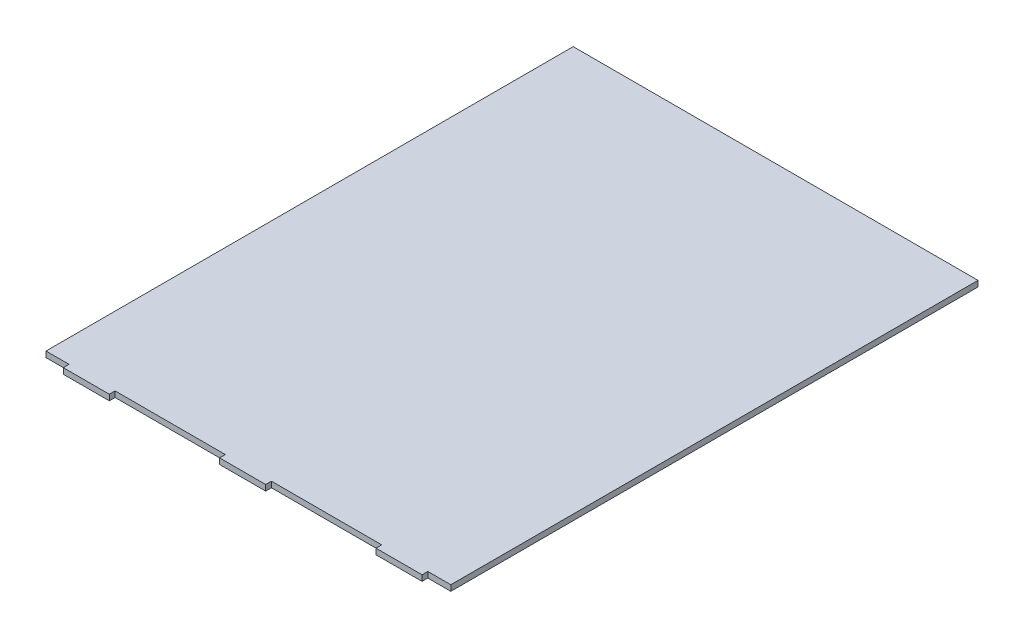
ISO-10303-21;
HEADER;
FILE_DESCRIPTION(('STEP AP214'),'2;1');
FILE_NAME('part.step','',(''),(''),'','','');
FILE_SCHEMA(('AUTOMOTIVE_DESIGN { 1 0 10303 214 1 1 1 1 }'));
ENDSEC;
DATA;
#1=APPLICATION_CONTEXT('core data for automotive mechanical design processes');
#2=APPLICATION_PROTOCOL_DEFINITION('international standard','automotive_design',2000,#1);
#3=PRODUCT_CONTEXT('',#1,'mechanical');
#4=PRODUCT('Part','Part','',(#3));
#5=PRODUCT_RELATED_PRODUCT_CATEGORY('part','',(#4));
#6=PRODUCT_DEFINITION_FORMATION('','',#4);
#7=PRODUCT_DEFINITION_CONTEXT('part definition',#1,'design');
#8=PRODUCT_DEFINITION('design','',#6,#7);
#9=PRODUCT_DEFINITION_SHAPE('','',#8);
#10=(LENGTH_UNIT() NAMED_UNIT(*) SI_UNIT(.MILLI.,.METRE.));
#11=(NAMED_UNIT(*) PLANE_ANGLE_UNIT() SI_UNIT($,.RADIAN.));
#12=(NAMED_UNIT(*) SI_UNIT($,.STERADIAN.) SOLID_ANGLE_UNIT());
#13=UNCERTAINTY_MEASURE_WITH_UNIT(LENGTH_MEASURE(1.E-05),#10,'distance_accuracy_value','');
#14=(GEOMETRIC_REPRESENTATION_CONTEXT(3) GLOBAL_UNCERTAINTY_ASSIGNED_CONTEXT((#13)) GLOBAL_UNIT_ASSIGNED_CONTEXT((#10,
#11,#12)) REPRESENTATION_CONTEXT('',''));
#15=CARTESIAN_POINT('',(0.,0.,0.));
#16=DIRECTION('',(0.,0.,1.));
#17=DIRECTION('',(1.,0.,0.));
#18=AXIS2_PLACEMENT_3D('',#15,#16,#17);
#19=CARTESIAN_POINT('',(0.,3.175,0.));
#20=DIRECTION('',(1.,0.,0.));
#21=DIRECTION('',(0.,0.,-1.));
#22=AXIS2_PLACEMENT_3D('',#19,#20,#21);
#23=PLANE('',#22);
#24=DIRECTION('',(0.,0.,1.));
#25=VECTOR('',#24,1.);
#26=CARTESIAN_POINT('',(0.,0.,0.));
#27=LINE('',#26,#25);
#28=CARTESIAN_POINT('',(0.,0.,-290.83));
#29=VERTEX_POINT('',#28);
#30=CARTESIAN_POINT('',(0.,0.,0.));
#31=VERTEX_POINT('',#30);
#32=EDGE_CURVE('E178',#29,#31,#27,.T.);
#33=ORIENTED_EDGE('',*,*,#32,.T.);
#34=DIRECTION('',(0.,-1.,0.));
#35=VECTOR('',#34,1.);
#36=CARTESIAN_POINT('',(0.,3.175,0.));
#37=LINE('',#36,#35);
#38=CARTESIAN_POINT('',(0.,3.175,0.));
#39=VERTEX_POINT('',#38);
#40=EDGE_CURVE('E11',#39,#31,#37,.T.);
#41=ORIENTED_EDGE('',*,*,#40,.F.);
#42=DIRECTION('',(0.,0.,1.));
#43=VECTOR('',#42,1.);
#44=CARTESIAN_POINT('',(0.,3.175,0.));
#45=LINE('',#44,#43);
#46=CARTESIAN_POINT('',(0.,3.175,-290.83));
#47=VERTEX_POINT('',#46);
#48=EDGE_CURVE('E210',#47,#39,#45,.T.);
#49=ORIENTED_EDGE('',*,*,#48,.F.);
#50=DIRECTION('',(0.,-1.,0.));
#51=VECTOR('',#50,1.);
#52=CARTESIAN_POINT('',(0.,3.175,-290.83));
#53=LINE('',#52,#51);
#54=EDGE_CURVE('E174',#47,#29,#53,.T.);
#55=ORIENTED_EDGE('',*,*,#54,.T.);
#56=EDGE_LOOP('',(#33,#41,#49,#55));
#57=FACE_BOUND('',#56,.T.);
#58=ADVANCED_FACE('F34',(#57),#23,.F.);
#59=CARTESIAN_POINT('',(0.,3.175,0.));
#60=DIRECTION('',(0.,0.,-1.));
#61=DIRECTION('',(-1.,0.,0.));
#62=AXIS2_PLACEMENT_3D('',#59,#60,#61);
#63=PLANE('',#62);
#64=DIRECTION('',(1.,0.,0.));
#65=VECTOR('',#64,1.);
#66=CARTESIAN_POINT('',(0.,0.,0.));
#67=LINE('',#66,#65);
#68=CARTESIAN_POINT('',(12.7,0.,0.));
#69=VERTEX_POINT('',#68);
#70=EDGE_CURVE('E181',#31,#69,#67,.T.);
#71=ORIENTED_EDGE('',*,*,#70,.T.);
#72=DIRECTION('',(0.,-1.,0.));
#73=VECTOR('',#72,1.);
#74=CARTESIAN_POINT('',(12.7,3.175,0.));
#75=LINE('',#74,#73);
#76=CARTESIAN_POINT('',(12.7,3.175,0.));
#77=VERTEX_POINT('',#76);
#78=EDGE_CURVE('E42',#77,#69,#75,.T.);
#79=ORIENTED_EDGE('',*,*,#78,.F.);
#80=DIRECTION('',(1.,0.,0.));
#81=VECTOR('',#80,1.);
#82=CARTESIAN_POINT('',(0.,3.175,0.));
#83=LINE('',#82,#81);
#84=EDGE_CURVE('E117',#39,#77,#83,.T.);
#85=ORIENTED_EDGE('',*,*,#84,.F.);
#86=ORIENTED_EDGE('',*,*,#40,.T.);
#87=EDGE_LOOP('',(#71,#79,#85,#86));
#88=FACE_BOUND('',#87,.T.);
#89=ADVANCED_FACE('F307',(#88),#63,.F.);
#90=CARTESIAN_POINT('',(12.7,3.175,3.175));
#91=DIRECTION('',(1.,0.,0.));
#92=DIRECTION('',(0.,0.,-1.));
#93=AXIS2_PLACEMENT_3D('',#90,#91,#92);
#94=PLANE('',#93);
#95=DIRECTION('',(0.,0.,1.));
#96=VECTOR('',#95,1.);
#97=CARTESIAN_POINT('',(12.7,0.,3.175));
#98=LINE('',#97,#96);
#99=CARTESIAN_POINT('',(12.7,0.,3.175));
#100=VERTEX_POINT('',#99);
#101=EDGE_CURVE('E183',#69,#100,#98,.T.);
#102=ORIENTED_EDGE('',*,*,#101,.T.);
#103=DIRECTION('',(0.,-1.,0.));
#104=VECTOR('',#103,1.);
#105=CARTESIAN_POINT('',(12.7,3.175,3.175));
#106=LINE('',#105,#104);
#107=CARTESIAN_POINT('',(12.7,3.175,3.175));
#108=VERTEX_POINT('',#107);
#109=EDGE_CURVE('E241',#108,#100,#106,.T.);
#110=ORIENTED_EDGE('',*,*,#109,.F.);
#111=DIRECTION('',(0.,0.,1.));
#112=VECTOR('',#111,1.);
#113=CARTESIAN_POINT('',(12.7,3.175,3.175));
#114=LINE('',#113,#112);
#115=EDGE_CURVE('E249',#77,#108,#114,.T.);
#116=ORIENTED_EDGE('',*,*,#115,.F.);
#117=ORIENTED_EDGE('',*,*,#78,.T.);
#118=EDGE_LOOP('',(#102,#110,#116,#117));
#119=FACE_BOUND('',#118,.T.);
#120=ADVANCED_FACE('F247',(#119),#94,.F.);
#121=CARTESIAN_POINT('',(12.7,3.175,3.175));
#122=DIRECTION('',(0.,0.,-1.));
#123=DIRECTION('',(-1.,0.,0.));
#124=AXIS2_PLACEMENT_3D('',#121,#122,#123);
#125=PLANE('',#124);
#126=DIRECTION('',(1.,0.,0.));
#127=VECTOR('',#126,1.);
#128=CARTESIAN_POINT('',(12.7,0.,3.175));
#129=LINE('',#128,#127);
#130=CARTESIAN_POINT('',(38.1,0.,3.175));
#131=VERTEX_POINT('',#130);
#132=EDGE_CURVE('E185',#100,#131,#129,.T.);
#133=ORIENTED_EDGE('',*,*,#132,.T.);
#134=DIRECTION('',(0.,-1.,0.));
#135=VECTOR('',#134,1.);
#136=CARTESIAN_POINT('',(38.1,3.175,3.175));
#137=LINE('',#136,#135);
#138=CARTESIAN_POINT('',(38.1,3.175,3.175));
#139=VERTEX_POINT('',#138);
#140=EDGE_CURVE('E238',#139,#131,#137,.T.);
#141=ORIENTED_EDGE('',*,*,#140,.F.);
#142=DIRECTION('',(1.,0.,0.));
#143=VECTOR('',#142,1.);
#144=CARTESIAN_POINT('',(12.7,3.175,3.175));
#145=LINE('',#144,#143);
#146=EDGE_CURVE('E266',#108,#139,#145,.T.);
#147=ORIENTED_EDGE('',*,*,#146,.F.);
#148=ORIENTED_EDGE('',*,*,#109,.T.);
#149=EDGE_LOOP('',(#133,#141,#147,#148));
#150=FACE_BOUND('',#149,.T.);
#151=ADVANCED_FACE('F257',(#150),#125,.F.);
#152=CARTESIAN_POINT('',(38.1,3.175,3.175));
#153=DIRECTION('',(-1.,0.,0.));
#154=DIRECTION('',(0.,0.,1.));
#155=AXIS2_PLACEMENT_3D('',#152,#153,#154);
#156=PLANE('',#155);
#157=DIRECTION('',(0.,0.,-1.));
#158=VECTOR('',#157,1.);
#159=CARTESIAN_POINT('',(38.1,0.,3.175));
#160=LINE('',#159,#158);
#161=CARTESIAN_POINT('',(38.1,0.,0.));
#162=VERTEX_POINT('',#161);
#163=EDGE_CURVE('E187',#131,#162,#160,.T.);
#164=ORIENTED_EDGE('',*,*,#163,.T.);
#165=DIRECTION('',(0.,-1.,0.));
#166=VECTOR('',#165,1.);
#167=CARTESIAN_POINT('',(38.1,3.175,0.));
#168=LINE('',#167,#166);
#169=CARTESIAN_POINT('',(38.1,3.175,0.));
#170=VERTEX_POINT('',#169);
#171=EDGE_CURVE('E235',#170,#162,#168,.T.);
#172=ORIENTED_EDGE('',*,*,#171,.F.);
#173=DIRECTION('',(0.,0.,-1.));
#174=VECTOR('',#173,1.);
#175=CARTESIAN_POINT('',(38.1,3.175,3.175));
#176=LINE('',#175,#174);
#177=EDGE_CURVE('E263',#139,#170,#176,.T.);
#178=ORIENTED_EDGE('',*,*,#177,.F.);
#179=ORIENTED_EDGE('',*,*,#140,.T.);
#180=EDGE_LOOP('',(#164,#172,#178,#179));
#181=FACE_BOUND('',#180,.T.);
#182=ADVANCED_FACE('F261',(#181),#156,.F.);
#183=CARTESIAN_POINT('',(96.7224283645198,3.175,0.));
#184=DIRECTION('',(0.,0.,-1.));
#185=DIRECTION('',(-1.,0.,0.));
#186=AXIS2_PLACEMENT_3D('',#183,#184,#185);
#187=PLANE('',#186);
#188=DIRECTION('',(1.,0.,0.));
#189=VECTOR('',#188,1.);
#190=CARTESIAN_POINT('',(96.7224283645198,0.,0.));
#191=LINE('',#190,#189);
#192=CARTESIAN_POINT('',(98.95586,0.,0.));
#193=VERTEX_POINT('',#192);
#194=EDGE_CURVE('E190',#162,#193,#191,.T.);
#195=ORIENTED_EDGE('',*,*,#194,.T.);
#196=DIRECTION('',(0.,-1.,0.));
#197=VECTOR('',#196,1.);
#198=CARTESIAN_POINT('',(98.95586,3.175,0.));
#199=LINE('',#198,#197);
#200=CARTESIAN_POINT('',(98.95586,3.175,0.));
#201=VERTEX_POINT('',#200);
#202=EDGE_CURVE('E232',#201,#193,#199,.T.);
#203=ORIENTED_EDGE('',*,*,#202,.F.);
#204=DIRECTION('',(1.,0.,0.));
#205=VECTOR('',#204,1.);
#206=CARTESIAN_POINT('',(38.1,3.175,0.));
#207=LINE('',#206,#205);
#208=EDGE_CURVE('E265',#170,#201,#207,.T.);
#209=ORIENTED_EDGE('',*,*,#208,.F.);
#210=ORIENTED_EDGE('',*,*,#171,.T.);
#211=EDGE_LOOP('',(#195,#203,#209,#210));
#212=FACE_BOUND('',#211,.T.);
#213=ADVANCED_FACE('F320',(#212),#187,.F.);
#214=CARTESIAN_POINT('',(98.95586,3.175,0.));
#215=DIRECTION('',(1.,0.,0.));
#216=DIRECTION('',(0.,0.,-1.));
#217=AXIS2_PLACEMENT_3D('',#214,#215,#216);
#218=PLANE('',#217);
#219=DIRECTION('',(0.,0.,1.));
#220=VECTOR('',#219,1.);
#221=CARTESIAN_POINT('',(98.95586,0.,0.));
#222=LINE('',#221,#220);
#223=CARTESIAN_POINT('',(98.95586,0.,3.175));
#224=VERTEX_POINT('',#223);
#225=EDGE_CURVE('E192',#193,#224,#222,.T.);
#226=ORIENTED_EDGE('',*,*,#225,.T.);
#227=DIRECTION('',(0.,-1.,0.));
#228=VECTOR('',#227,1.);
#229=CARTESIAN_POINT('',(98.95586,3.175,3.175));
#230=LINE('',#229,#228);
#231=CARTESIAN_POINT('',(98.95586,3.175,3.175));
#232=VERTEX_POINT('',#231);
#233=EDGE_CURVE('E229',#232,#224,#230,.T.);
#234=ORIENTED_EDGE('',*,*,#233,.F.);
#235=DIRECTION('',(0.,0.,1.));
#236=VECTOR('',#235,1.);
#237=CARTESIAN_POINT('',(98.95586,3.175,0.));
#238=LINE('',#237,#236);
#239=EDGE_CURVE('E268',#201,#232,#238,.T.);
#240=ORIENTED_EDGE('',*,*,#239,.F.);
#241=ORIENTED_EDGE('',*,*,#202,.T.);
#242=EDGE_LOOP('',(#226,#234,#240,#241));
#243=FACE_BOUND('',#242,.T.);
#244=ADVANCED_FACE('F323',(#243),#218,.F.);
#245=CARTESIAN_POINT('',(98.95586,3.175,3.175));
#246=DIRECTION('',(0.,0.,-1.));
#247=DIRECTION('',(-1.,0.,0.));
#248=AXIS2_PLACEMENT_3D('',#245,#246,#247);
#249=PLANE('',#248);
#250=DIRECTION('',(1.,0.,0.));
#251=VECTOR('',#250,1.);
#252=CARTESIAN_POINT('',(98.95586,0.,3.175));
#253=LINE('',#252,#251);
#254=CARTESIAN_POINT('',(124.35586,0.,3.175));
#255=VERTEX_POINT('',#254);
#256=EDGE_CURVE('E194',#224,#255,#253,.T.);
#257=ORIENTED_EDGE('',*,*,#256,.T.);
#258=DIRECTION('',(0.,-1.,0.));
#259=VECTOR('',#258,1.);
#260=CARTESIAN_POINT('',(124.35586,3.175,3.175));
#261=LINE('',#260,#259);
#262=CARTESIAN_POINT('',(124.35586,3.175,3.175));
#263=VERTEX_POINT('',#262);
#264=EDGE_CURVE('E226',#263,#255,#261,.T.);
#265=ORIENTED_EDGE('',*,*,#264,.F.);
#266=DIRECTION('',(1.,0.,0.));
#267=VECTOR('',#266,1.);
#268=CARTESIAN_POINT('',(98.95586,3.175,3.175));
#269=LINE('',#268,#267);
#270=EDGE_CURVE('E274',#232,#263,#269,.T.);
#271=ORIENTED_EDGE('',*,*,#270,.F.);
#272=ORIENTED_EDGE('',*,*,#233,.T.);
#273=EDGE_LOOP('',(#257,#265,#271,#272));
#274=FACE_BOUND('',#273,.T.);
#275=ADVANCED_FACE('F327',(#274),#249,.F.);
#276=CARTESIAN_POINT('',(124.35586,3.175,0.));
#277=DIRECTION('',(-1.,0.,0.));
#278=DIRECTION('',(0.,0.,1.));
#279=AXIS2_PLACEMENT_3D('',#276,#277,#278);
#280=PLANE('',#279);
#281=DIRECTION('',(0.,0.,-1.));
#282=VECTOR('',#281,1.);
#283=CARTESIAN_POINT('',(124.35586,0.,0.));
#284=LINE('',#283,#282);
#285=CARTESIAN_POINT('',(124.35586,0.,0.));
#286=VERTEX_POINT('',#285);
#287=EDGE_CURVE('E196',#255,#286,#284,.T.);
#288=ORIENTED_EDGE('',*,*,#287,.T.);
#289=DIRECTION('',(0.,-1.,0.));
#290=VECTOR('',#289,1.);
#291=CARTESIAN_POINT('',(124.35586,3.175,0.));
#292=LINE('',#291,#290);
#293=CARTESIAN_POINT('',(124.35586,3.175,0.));
#294=VERTEX_POINT('',#293);
#295=EDGE_CURVE('E223',#294,#286,#292,.T.);
#296=ORIENTED_EDGE('',*,*,#295,.F.);
#297=DIRECTION('',(0.,0.,-1.));
#298=VECTOR('',#297,1.);
#299=CARTESIAN_POINT('',(124.35586,3.175,0.));
#300=LINE('',#299,#298);
#301=EDGE_CURVE('E276',#263,#294,#300,.T.);
#302=ORIENTED_EDGE('',*,*,#301,.F.);
#303=ORIENTED_EDGE('',*,*,#264,.T.);
#304=EDGE_LOOP('',(#288,#296,#302,#303));
#305=FACE_BOUND('',#304,.T.);
#306=ADVANCED_FACE('F331',(#305),#280,.F.);
#307=CARTESIAN_POINT('',(180.74485672904,3.175,0.));
#308=DIRECTION('',(0.,0.,-1.));
#309=DIRECTION('',(-1.,0.,0.));
#310=AXIS2_PLACEMENT_3D('',#307,#308,#309);
#311=PLANE('',#310);
#312=DIRECTION('',(1.,0.,0.));
#313=VECTOR('',#312,1.);
#314=CARTESIAN_POINT('',(180.74485672904,0.,0.));
#315=LINE('',#314,#313);
#316=CARTESIAN_POINT('',(185.21172,0.,0.));
#317=VERTEX_POINT('',#316);
#318=EDGE_CURVE('E199',#286,#317,#315,.T.);
#319=ORIENTED_EDGE('',*,*,#318,.T.);
#320=DIRECTION('',(0.,-1.,0.));
#321=VECTOR('',#320,1.);
#322=CARTESIAN_POINT('',(185.21172,3.175,0.));
#323=LINE('',#322,#321);
#324=CARTESIAN_POINT('',(185.21172,3.175,0.));
#325=VERTEX_POINT('',#324);
#326=EDGE_CURVE('E220',#325,#317,#323,.T.);
#327=ORIENTED_EDGE('',*,*,#326,.F.);
#328=DIRECTION('',(1.,0.,0.));
#329=VECTOR('',#328,1.);
#330=CARTESIAN_POINT('',(124.35586,3.175,0.));
#331=LINE('',#330,#329);
#332=EDGE_CURVE('E278',#294,#325,#331,.T.);
#333=ORIENTED_EDGE('',*,*,#332,.F.);
#334=ORIENTED_EDGE('',*,*,#295,.T.);
#335=EDGE_LOOP('',(#319,#327,#333,#334));
#336=FACE_BOUND('',#335,.T.);
#337=ADVANCED_FACE('F335',(#336),#311,.F.);
#338=CARTESIAN_POINT('',(185.21172,3.175,3.17500000000003));
#339=DIRECTION('',(1.,0.,0.));
#340=DIRECTION('',(0.,0.,-1.));
#341=AXIS2_PLACEMENT_3D('',#338,#339,#340);
#342=PLANE('',#341);
#343=DIRECTION('',(0.,0.,1.));
#344=VECTOR('',#343,1.);
#345=CARTESIAN_POINT('',(185.21172,0.,3.17500000000003));
#346=LINE('',#345,#344);
#347=CARTESIAN_POINT('',(185.21172,0.,3.17500000000003));
#348=VERTEX_POINT('',#347);
#349=EDGE_CURVE('E201',#317,#348,#346,.T.);
#350=ORIENTED_EDGE('',*,*,#349,.T.);
#351=DIRECTION('',(0.,-1.,0.));
#352=VECTOR('',#351,1.);
#353=CARTESIAN_POINT('',(185.21172,3.175,3.17500000000003));
#354=LINE('',#353,#352);
#355=CARTESIAN_POINT('',(185.21172,3.175,3.17500000000003));
#356=VERTEX_POINT('',#355);
#357=EDGE_CURVE('E217',#356,#348,#354,.T.);
#358=ORIENTED_EDGE('',*,*,#357,.F.);
#359=DIRECTION('',(0.,0.,1.));
#360=VECTOR('',#359,1.);
#361=CARTESIAN_POINT('',(185.21172,3.175,3.17500000000003));
#362=LINE('',#361,#360);
#363=EDGE_CURVE('E280',#325,#356,#362,.T.);
#364=ORIENTED_EDGE('',*,*,#363,.F.);
#365=ORIENTED_EDGE('',*,*,#326,.T.);
#366=EDGE_LOOP('',(#350,#358,#364,#365));
#367=FACE_BOUND('',#366,.T.);
#368=ADVANCED_FACE('F339',(#367),#342,.F.);
#369=CARTESIAN_POINT('',(210.61172,3.175,3.17500000000003));
#370=DIRECTION('',(0.,0.,-1.));
#371=DIRECTION('',(-1.,0.,0.));
#372=AXIS2_PLACEMENT_3D('',#369,#370,#371);
#373=PLANE('',#372);
#374=DIRECTION('',(1.,0.,0.));
#375=VECTOR('',#374,1.);
#376=CARTESIAN_POINT('',(210.61172,0.,3.17500000000003));
#377=LINE('',#376,#375);
#378=CARTESIAN_POINT('',(210.61172,0.,3.17500000000003));
#379=VERTEX_POINT('',#378);
#380=EDGE_CURVE('E203',#348,#379,#377,.T.);
#381=ORIENTED_EDGE('',*,*,#380,.T.);
#382=DIRECTION('',(0.,-1.,0.));
#383=VECTOR('',#382,1.);
#384=CARTESIAN_POINT('',(210.61172,3.175,3.17500000000003));
#385=LINE('',#384,#383);
#386=CARTESIAN_POINT('',(210.61172,3.175,3.17500000000003));
#387=VERTEX_POINT('',#386);
#388=EDGE_CURVE('E214',#387,#379,#385,.T.);
#389=ORIENTED_EDGE('',*,*,#388,.F.);
#390=DIRECTION('',(1.,0.,0.));
#391=VECTOR('',#390,1.);
#392=CARTESIAN_POINT('',(210.61172,3.175,3.17500000000003));
#393=LINE('',#392,#391);
#394=EDGE_CURVE('E282',#356,#387,#393,.T.);
#395=ORIENTED_EDGE('',*,*,#394,.F.);
#396=ORIENTED_EDGE('',*,*,#357,.T.);
#397=EDGE_LOOP('',(#381,#389,#395,#396));
#398=FACE_BOUND('',#397,.T.);
#399=ADVANCED_FACE('F288',(#398),#373,.F.);
#400=CARTESIAN_POINT('',(210.61172,3.175,3.17500000000003));
#401=DIRECTION('',(-1.,0.,0.));
#402=DIRECTION('',(0.,0.,1.));
#403=AXIS2_PLACEMENT_3D('',#400,#401,#402);
#404=PLANE('',#403);
#405=DIRECTION('',(0.,0.,-1.));
#406=VECTOR('',#405,1.);
#407=CARTESIAN_POINT('',(210.61172,0.,3.17500000000003));
#408=LINE('',#407,#406);
#409=CARTESIAN_POINT('',(210.61172,0.,0.));
#410=VERTEX_POINT('',#409);
#411=EDGE_CURVE('E205',#379,#410,#408,.T.);
#412=ORIENTED_EDGE('',*,*,#411,.T.);
#413=DIRECTION('',(0.,-1.,0.));
#414=VECTOR('',#413,1.);
#415=CARTESIAN_POINT('',(210.61172,3.175,0.));
#416=LINE('',#415,#414);
#417=CARTESIAN_POINT('',(210.61172,3.175,0.));
#418=VERTEX_POINT('',#417);
#419=EDGE_CURVE('E169',#418,#410,#416,.T.);
#420=ORIENTED_EDGE('',*,*,#419,.F.);
#421=DIRECTION('',(0.,0.,-1.));
#422=VECTOR('',#421,1.);
#423=CARTESIAN_POINT('',(210.61172,3.175,3.17500000000003));
#424=LINE('',#423,#422);
#425=EDGE_CURVE('E160',#387,#418,#424,.T.);
#426=ORIENTED_EDGE('',*,*,#425,.F.);
#427=ORIENTED_EDGE('',*,*,#388,.T.);
#428=EDGE_LOOP('',(#412,#420,#426,#427));
#429=FACE_BOUND('',#428,.T.);
#430=ADVANCED_FACE('F292',(#429),#404,.F.);
#431=CARTESIAN_POINT('',(210.61172,3.175,0.));
#432=DIRECTION('',(0.,0.,-1.));
#433=DIRECTION('',(-1.,0.,0.));
#434=AXIS2_PLACEMENT_3D('',#431,#432,#433);
#435=PLANE('',#434);
#436=DIRECTION('',(1.,0.,0.));
#437=VECTOR('',#436,1.);
#438=CARTESIAN_POINT('',(210.61172,0.,0.));
#439=LINE('',#438,#437);
#440=CARTESIAN_POINT('',(223.31172,0.,0.));
#441=VERTEX_POINT('',#440);
#442=EDGE_CURVE('E168',#410,#441,#439,.T.);
#443=ORIENTED_EDGE('',*,*,#442,.T.);
#444=DIRECTION('',(0.,-1.,0.));
#445=VECTOR('',#444,1.);
#446=CARTESIAN_POINT('',(223.31172,3.175,0.));
#447=LINE('',#446,#445);
#448=CARTESIAN_POINT('',(223.31172,3.175,0.));
#449=VERTEX_POINT('',#448);
#450=EDGE_CURVE('E165',#449,#441,#447,.T.);
#451=ORIENTED_EDGE('',*,*,#450,.F.);
#452=DIRECTION('',(1.,0.,0.));
#453=VECTOR('',#452,1.);
#454=CARTESIAN_POINT('',(210.61172,3.175,0.));
#455=LINE('',#454,#453);
#456=EDGE_CURVE('E154',#418,#449,#455,.T.);
#457=ORIENTED_EDGE('',*,*,#456,.F.);
#458=ORIENTED_EDGE('',*,*,#419,.T.);
#459=EDGE_LOOP('',(#443,#451,#457,#458));
#460=FACE_BOUND('',#459,.T.);
#461=ADVANCED_FACE('F166',(#460),#435,.F.);
#462=CARTESIAN_POINT('',(223.31172,3.175,0.));
#463=DIRECTION('',(-1.,0.,0.));
#464=DIRECTION('',(0.,0.,1.));
#465=AXIS2_PLACEMENT_3D('',#462,#463,#464);
#466=PLANE('',#465);
#467=DIRECTION('',(0.,0.,-1.));
#468=VECTOR('',#467,1.);
#469=CARTESIAN_POINT('',(223.31172,0.,0.));
#470=LINE('',#469,#468);
#471=CARTESIAN_POINT('',(223.31172,0.,-290.83));
#472=VERTEX_POINT('',#471);
#473=EDGE_CURVE('E103',#441,#472,#470,.T.);
#474=ORIENTED_EDGE('',*,*,#473,.T.);
#475=DIRECTION('',(0.,-1.,0.));
#476=VECTOR('',#475,1.);
#477=CARTESIAN_POINT('',(223.31172,3.175,-290.83));
#478=LINE('',#477,#476);
#479=CARTESIAN_POINT('',(223.31172,3.175,-290.83));
#480=VERTEX_POINT('',#479);
#481=EDGE_CURVE('E170',#480,#472,#478,.T.);
#482=ORIENTED_EDGE('',*,*,#481,.F.);
#483=DIRECTION('',(0.,0.,-1.));
#484=VECTOR('',#483,1.);
#485=CARTESIAN_POINT('',(223.31172,3.175,0.));
#486=LINE('',#485,#484);
#487=EDGE_CURVE('E158',#449,#480,#486,.T.);
#488=ORIENTED_EDGE('',*,*,#487,.F.);
#489=ORIENTED_EDGE('',*,*,#450,.T.);
#490=EDGE_LOOP('',(#474,#482,#488,#489));
#491=FACE_BOUND('',#490,.T.);
#492=ADVANCED_FACE('F172',(#491),#466,.F.);
#493=CARTESIAN_POINT('',(0.,3.175,-290.83));
#494=DIRECTION('',(0.,0.,1.));
#495=DIRECTION('',(1.,0.,0.));
#496=AXIS2_PLACEMENT_3D('',#493,#494,#495);
#497=PLANE('',#496);
#498=DIRECTION('',(-1.,0.,0.));
#499=VECTOR('',#498,1.);
#500=CARTESIAN_POINT('',(0.,0.,-290.83));
#501=LINE('',#500,#499);
#502=EDGE_CURVE('E109',#472,#29,#501,.T.);
#503=ORIENTED_EDGE('',*,*,#502,.T.);
#504=ORIENTED_EDGE('',*,*,#54,.F.);
#505=DIRECTION('',(-1.,0.,0.));
#506=VECTOR('',#505,1.);
#507=CARTESIAN_POINT('',(0.,3.175,-290.83));
#508=LINE('',#507,#506);
#509=EDGE_CURVE('E50',#480,#47,#508,.T.);
#510=ORIENTED_EDGE('',*,*,#509,.F.);
#511=ORIENTED_EDGE('',*,*,#481,.T.);
#512=EDGE_LOOP('',(#503,#504,#510,#511));
#513=FACE_BOUND('',#512,.T.);
#514=ADVANCED_FACE('F296',(#513),#497,.F.);
#515=CARTESIAN_POINT('',(0.,3.175,0.));
#516=DIRECTION('',(0.,-1.,0.));
#517=DIRECTION('',(0.,0.,-1.));
#518=AXIS2_PLACEMENT_3D('',#515,#516,#517);
#519=PLANE('',#518);
#520=ORIENTED_EDGE('',*,*,#48,.T.);
#521=ORIENTED_EDGE('',*,*,#84,.T.);
#522=ORIENTED_EDGE('',*,*,#115,.T.);
#523=ORIENTED_EDGE('',*,*,#146,.T.);
#524=ORIENTED_EDGE('',*,*,#177,.T.);
#525=ORIENTED_EDGE('',*,*,#208,.T.);
#526=ORIENTED_EDGE('',*,*,#239,.T.);
#527=ORIENTED_EDGE('',*,*,#270,.T.);
#528=ORIENTED_EDGE('',*,*,#301,.T.);
#529=ORIENTED_EDGE('',*,*,#332,.T.);
#530=ORIENTED_EDGE('',*,*,#363,.T.);
#531=ORIENTED_EDGE('',*,*,#394,.T.);
#532=ORIENTED_EDGE('',*,*,#425,.T.);
#533=ORIENTED_EDGE('',*,*,#456,.T.);
#534=ORIENTED_EDGE('',*,*,#487,.T.);
#535=ORIENTED_EDGE('',*,*,#509,.T.);
#536=EDGE_LOOP('',(#520,#521,#522,#523,#524,#525,#526,#527,#528,#529,#530,#531,#532,#533,#534,#535));
#537=FACE_BOUND('',#536,.T.);
#538=ADVANCED_FACE('F156',(#537),#519,.F.);
#539=CARTESIAN_POINT('',(0.,0.,0.));
#540=DIRECTION('',(0.,-1.,0.));
#541=DIRECTION('',(0.,0.,-1.));
#542=AXIS2_PLACEMENT_3D('',#539,#540,#541);
#543=PLANE('',#542);
#544=ORIENTED_EDGE('',*,*,#32,.F.);
#545=ORIENTED_EDGE('',*,*,#502,.F.);
#546=ORIENTED_EDGE('',*,*,#473,.F.);
#547=ORIENTED_EDGE('',*,*,#442,.F.);
#548=ORIENTED_EDGE('',*,*,#411,.F.);
#549=ORIENTED_EDGE('',*,*,#380,.F.);
#550=ORIENTED_EDGE('',*,*,#349,.F.);
#551=ORIENTED_EDGE('',*,*,#318,.F.);
#552=ORIENTED_EDGE('',*,*,#287,.F.);
#553=ORIENTED_EDGE('',*,*,#256,.F.);
#554=ORIENTED_EDGE('',*,*,#225,.F.);
#555=ORIENTED_EDGE('',*,*,#194,.F.);
#556=ORIENTED_EDGE('',*,*,#163,.F.);
#557=ORIENTED_EDGE('',*,*,#132,.F.);
#558=ORIENTED_EDGE('',*,*,#101,.F.);
#559=ORIENTED_EDGE('',*,*,#70,.F.);
#560=EDGE_LOOP('',(#544,#545,#546,#547,#548,#549,#550,#551,#552,#553,#554,#555,#556,#557,#558,#559));
#561=FACE_BOUND('',#560,.T.);
#562=ADVANCED_FACE('F253',(#561),#543,.T.);
#563=CLOSED_SHELL('',(#58,#89,#120,#151,#182,#213,#244,#275,#306,#337,#368,#399,#430,#461,#492,
#514,#538,#562));
#564=MANIFOLD_SOLID_BREP('B2',#563);
#565=ADVANCED_BREP_SHAPE_REPRESENTATION('',(#18,#564),#14);
#566=SHAPE_DEFINITION_REPRESENTATION(#9,#565);
ENDSEC;
END-ISO-10303-21;
